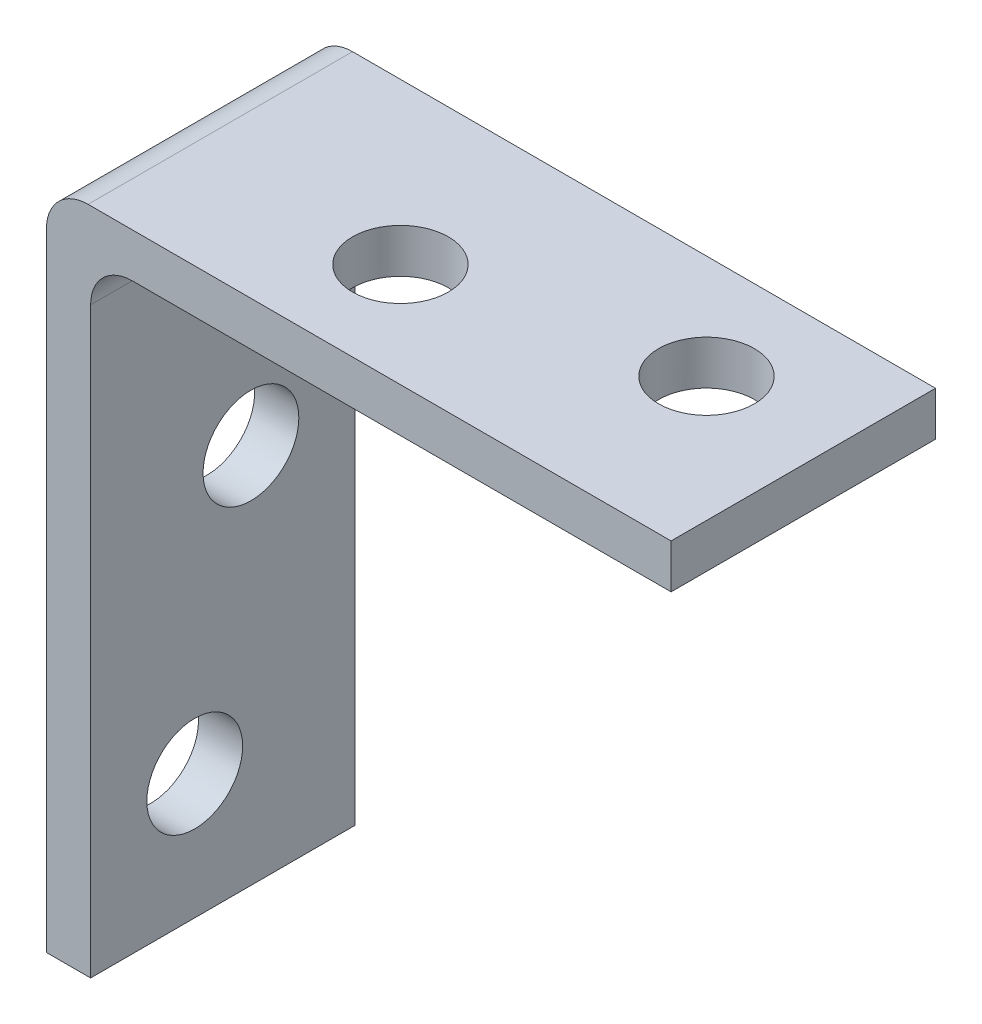
ISO-10303-21;
HEADER;
FILE_DESCRIPTION(('STEP AP214'),'2;1');
FILE_NAME('part.step','',(''),(''),'','','');
FILE_SCHEMA(('AUTOMOTIVE_DESIGN { 1 0 10303 214 1 1 1 1 }'));
ENDSEC;
DATA;
#1=APPLICATION_CONTEXT('core data for automotive mechanical design processes');
#2=APPLICATION_PROTOCOL_DEFINITION('international standard','automotive_design',2000,#1);
#3=PRODUCT_CONTEXT('',#1,'mechanical');
#4=PRODUCT('Part','Part','',(#3));
#5=PRODUCT_RELATED_PRODUCT_CATEGORY('part','',(#4));
#6=PRODUCT_DEFINITION_FORMATION('','',#4);
#7=PRODUCT_DEFINITION_CONTEXT('part definition',#1,'design');
#8=PRODUCT_DEFINITION('design','',#6,#7);
#9=PRODUCT_DEFINITION_SHAPE('','',#8);
#10=(LENGTH_UNIT() NAMED_UNIT(*) SI_UNIT(.MILLI.,.METRE.));
#11=(NAMED_UNIT(*) PLANE_ANGLE_UNIT() SI_UNIT($,.RADIAN.));
#12=(NAMED_UNIT(*) SI_UNIT($,.STERADIAN.) SOLID_ANGLE_UNIT());
#13=UNCERTAINTY_MEASURE_WITH_UNIT(LENGTH_MEASURE(1.E-05),#10,'distance_accuracy_value','');
#14=(GEOMETRIC_REPRESENTATION_CONTEXT(3) GLOBAL_UNCERTAINTY_ASSIGNED_CONTEXT((#13)) GLOBAL_UNIT_ASSIGNED_CONTEXT((#10,
#11,#12)) REPRESENTATION_CONTEXT('',''));
#15=CARTESIAN_POINT('',(0.,0.,0.));
#16=DIRECTION('',(0.,0.,1.));
#17=DIRECTION('',(1.,0.,0.));
#18=AXIS2_PLACEMENT_3D('',#15,#16,#17);
#19=CARTESIAN_POINT('',(0.,38.1,-8.0645));
#20=DIRECTION('',(-1.,0.,0.));
#21=DIRECTION('',(0.,0.,1.));
#22=AXIS2_PLACEMENT_3D('',#19,#20,#21);
#23=PLANE('',#22);
#24=CARTESIAN_POINT('',(0.,7.62,1.7145));
#25=DIRECTION('',(-1.,0.,0.));
#26=DIRECTION('',(0.,0.,1.));
#27=AXIS2_PLACEMENT_3D('',#24,#25,#26);
#28=CIRCLE('',#27,2.921);
#29=CARTESIAN_POINT('',(0.,7.62,4.6355));
#30=VERTEX_POINT('',#29);
#31=EDGE_CURVE('E117',#30,#30,#28,.T.);
#32=ORIENTED_EDGE('',*,*,#31,.F.);
#33=EDGE_LOOP('',(#32));
#34=FACE_BOUND('',#33,.T.);
#35=CARTESIAN_POINT('',(0.,23.241,-1.7145));
#36=DIRECTION('',(-1.,0.,0.));
#37=DIRECTION('',(0.,0.,1.));
#38=AXIS2_PLACEMENT_3D('',#35,#36,#37);
#39=CIRCLE('',#38,2.921);
#40=CARTESIAN_POINT('',(0.,23.241,1.2065));
#41=VERTEX_POINT('',#40);
#42=EDGE_CURVE('E265',#41,#41,#39,.T.);
#43=ORIENTED_EDGE('',*,*,#42,.F.);
#44=EDGE_LOOP('',(#43));
#45=FACE_BOUND('',#44,.T.);
#46=DIRECTION('',(0.,-1.,0.));
#47=VECTOR('',#46,1.);
#48=CARTESIAN_POINT('',(0.,0.,8.0645));
#49=LINE('',#48,#47);
#50=CARTESIAN_POINT('',(0.,38.2524,8.0645));
#51=VERTEX_POINT('',#50);
#52=CARTESIAN_POINT('',(0.,0.,8.0645));
#53=VERTEX_POINT('',#52);
#54=EDGE_CURVE('E105',#51,#53,#49,.T.);
#55=ORIENTED_EDGE('',*,*,#54,.F.);
#56=DIRECTION('',(0.,0.,1.));
#57=VECTOR('',#56,1.);
#58=CARTESIAN_POINT('',(0.,38.2524,-8.0645));
#59=LINE('',#58,#57);
#60=CARTESIAN_POINT('',(0.,38.2524,-8.0645));
#61=VERTEX_POINT('',#60);
#62=EDGE_CURVE('E181',#51,#61,#59,.F.);
#63=ORIENTED_EDGE('',*,*,#62,.T.);
#64=DIRECTION('',(0.,-1.,0.));
#65=VECTOR('',#64,1.);
#66=CARTESIAN_POINT('',(0.,0.,-8.0645));
#67=LINE('',#66,#65);
#68=CARTESIAN_POINT('',(0.,0.,-8.0645));
#69=VERTEX_POINT('',#68);
#70=EDGE_CURVE('E122',#61,#69,#67,.T.);
#71=ORIENTED_EDGE('',*,*,#70,.T.);
#72=DIRECTION('',(0.,0.,1.));
#73=VECTOR('',#72,1.);
#74=CARTESIAN_POINT('',(0.,0.,-8.0645));
#75=LINE('',#74,#73);
#76=EDGE_CURVE('E120',#69,#53,#75,.T.);
#77=ORIENTED_EDGE('',*,*,#76,.T.);
#78=EDGE_LOOP('',(#55,#63,#71,#77));
#79=FACE_BOUND('',#78,.T.);
#80=ADVANCED_FACE('F39',(#34,#45,#79),#23,.T.);
#81=CARTESIAN_POINT('',(0.,40.7924,-8.0645));
#82=DIRECTION('',(0.,1.,0.));
#83=DIRECTION('',(0.,0.,1.));
#84=AXIS2_PLACEMENT_3D('',#81,#82,#83);
#85=PLANE('',#84);
#86=CARTESIAN_POINT('',(30.48,40.7924,-1.7145));
#87=DIRECTION('',(0.,1.,0.));
#88=DIRECTION('',(0.,0.,1.));
#89=AXIS2_PLACEMENT_3D('',#86,#87,#88);
#90=CIRCLE('',#89,2.921);
#91=CARTESIAN_POINT('',(30.48,40.7924,1.2065));
#92=VERTEX_POINT('',#91);
#93=EDGE_CURVE('E255',#92,#92,#90,.F.);
#94=ORIENTED_EDGE('',*,*,#93,.T.);
#95=EDGE_LOOP('',(#94));
#96=FACE_BOUND('',#95,.T.);
#97=CARTESIAN_POINT('',(15.24,40.7924,1.7145));
#98=DIRECTION('',(0.,1.,0.));
#99=DIRECTION('',(0.,0.,1.));
#100=AXIS2_PLACEMENT_3D('',#97,#98,#99);
#101=CIRCLE('',#100,2.921);
#102=CARTESIAN_POINT('',(15.24,40.7924,4.6355));
#103=VERTEX_POINT('',#102);
#104=EDGE_CURVE('E272',#103,#103,#101,.F.);
#105=ORIENTED_EDGE('',*,*,#104,.T.);
#106=EDGE_LOOP('',(#105));
#107=FACE_BOUND('',#106,.T.);
#108=DIRECTION('',(-1.,0.,0.));
#109=VECTOR('',#108,1.);
#110=CARTESIAN_POINT('',(0.,40.7924,-8.0645));
#111=LINE('',#110,#109);
#112=CARTESIAN_POINT('',(38.1,40.7924,-8.0645));
#113=VERTEX_POINT('',#112);
#114=CARTESIAN_POINT('',(2.54,40.7924,-8.0645));
#115=VERTEX_POINT('',#114);
#116=EDGE_CURVE('E128',#113,#115,#111,.T.);
#117=ORIENTED_EDGE('',*,*,#116,.T.);
#118=DIRECTION('',(0.,0.,1.));
#119=VECTOR('',#118,1.);
#120=CARTESIAN_POINT('',(2.54,40.7924,-8.0645));
#121=LINE('',#120,#119);
#122=CARTESIAN_POINT('',(2.54,40.7924,8.0645));
#123=VERTEX_POINT('',#122);
#124=EDGE_CURVE('E169',#115,#123,#121,.T.);
#125=ORIENTED_EDGE('',*,*,#124,.T.);
#126=DIRECTION('',(-1.,0.,0.));
#127=VECTOR('',#126,1.);
#128=CARTESIAN_POINT('',(0.,40.7924,8.0645));
#129=LINE('',#128,#127);
#130=CARTESIAN_POINT('',(38.1,40.7924,8.0645));
#131=VERTEX_POINT('',#130);
#132=EDGE_CURVE('E145',#131,#123,#129,.T.);
#133=ORIENTED_EDGE('',*,*,#132,.F.);
#134=DIRECTION('',(0.,0.,1.));
#135=VECTOR('',#134,1.);
#136=CARTESIAN_POINT('',(38.1,40.7924,-8.0645));
#137=LINE('',#136,#135);
#138=EDGE_CURVE('E166',#113,#131,#137,.T.);
#139=ORIENTED_EDGE('',*,*,#138,.F.);
#140=EDGE_LOOP('',(#117,#125,#133,#139));
#141=FACE_BOUND('',#140,.T.);
#142=ADVANCED_FACE('F208',(#96,#107,#141),#85,.T.);
#143=CARTESIAN_POINT('',(38.1,38.1,-8.0645));
#144=DIRECTION('',(1.,0.,0.));
#145=DIRECTION('',(0.,0.,-1.));
#146=AXIS2_PLACEMENT_3D('',#143,#144,#145);
#147=PLANE('',#146);
#148=ORIENTED_EDGE('',*,*,#138,.T.);
#149=DIRECTION('',(0.,1.,0.));
#150=VECTOR('',#149,1.);
#151=CARTESIAN_POINT('',(38.1,38.1,8.0645));
#152=LINE('',#151,#150);
#153=CARTESIAN_POINT('',(38.1,38.1,8.0645));
#154=VERTEX_POINT('',#153);
#155=EDGE_CURVE('E141',#154,#131,#152,.T.);
#156=ORIENTED_EDGE('',*,*,#155,.F.);
#157=DIRECTION('',(0.,0.,1.));
#158=VECTOR('',#157,1.);
#159=CARTESIAN_POINT('',(38.1,38.1,-8.0645));
#160=LINE('',#159,#158);
#161=CARTESIAN_POINT('',(38.1,38.1,-8.0645));
#162=VERTEX_POINT('',#161);
#163=EDGE_CURVE('E170',#162,#154,#160,.T.);
#164=ORIENTED_EDGE('',*,*,#163,.F.);
#165=DIRECTION('',(0.,1.,0.));
#166=VECTOR('',#165,1.);
#167=CARTESIAN_POINT('',(38.1,38.1,-8.0645));
#168=LINE('',#167,#166);
#169=EDGE_CURVE('E159',#162,#113,#168,.T.);
#170=ORIENTED_EDGE('',*,*,#169,.T.);
#171=EDGE_LOOP('',(#148,#156,#164,#170));
#172=FACE_BOUND('',#171,.T.);
#173=ADVANCED_FACE('F210',(#172),#147,.T.);
#174=CARTESIAN_POINT('',(2.6924,38.1,-8.0645));
#175=DIRECTION('',(0.,-1.,0.));
#176=DIRECTION('',(0.,0.,-1.));
#177=AXIS2_PLACEMENT_3D('',#174,#175,#176);
#178=PLANE('',#177);
#179=CARTESIAN_POINT('',(30.48,38.1,-1.7145));
#180=DIRECTION('',(0.,-1.,0.));
#181=DIRECTION('',(0.,0.,-1.));
#182=AXIS2_PLACEMENT_3D('',#179,#180,#181);
#183=CIRCLE('',#182,2.921);
#184=CARTESIAN_POINT('',(30.48,38.1,-4.6355));
#185=VERTEX_POINT('',#184);
#186=EDGE_CURVE('E258',#185,#185,#183,.T.);
#187=ORIENTED_EDGE('',*,*,#186,.F.);
#188=EDGE_LOOP('',(#187));
#189=FACE_BOUND('',#188,.T.);
#190=CARTESIAN_POINT('',(15.24,38.1,1.7145));
#191=DIRECTION('',(0.,-1.,0.));
#192=DIRECTION('',(0.,0.,-1.));
#193=AXIS2_PLACEMENT_3D('',#190,#191,#192);
#194=CIRCLE('',#193,2.921);
#195=CARTESIAN_POINT('',(15.24,38.1,-1.2065));
#196=VERTEX_POINT('',#195);
#197=EDGE_CURVE('E266',#196,#196,#194,.T.);
#198=ORIENTED_EDGE('',*,*,#197,.F.);
#199=EDGE_LOOP('',(#198));
#200=FACE_BOUND('',#199,.T.);
#201=DIRECTION('',(1.,0.,0.));
#202=VECTOR('',#201,1.);
#203=CARTESIAN_POINT('',(2.6924,38.1,8.0645));
#204=LINE('',#203,#202);
#205=CARTESIAN_POINT('',(5.2324,38.1,8.0645));
#206=VERTEX_POINT('',#205);
#207=EDGE_CURVE('E135',#206,#154,#204,.T.);
#208=ORIENTED_EDGE('',*,*,#207,.F.);
#209=DIRECTION('',(0.,0.,1.));
#210=VECTOR('',#209,1.);
#211=CARTESIAN_POINT('',(5.2324,38.1,-8.0645));
#212=LINE('',#211,#210);
#213=CARTESIAN_POINT('',(5.2324,38.1,-8.0645));
#214=VERTEX_POINT('',#213);
#215=EDGE_CURVE('E61',#206,#214,#212,.F.);
#216=ORIENTED_EDGE('',*,*,#215,.T.);
#217=DIRECTION('',(1.,0.,0.));
#218=VECTOR('',#217,1.);
#219=CARTESIAN_POINT('',(2.6924,38.1,-8.0645));
#220=LINE('',#219,#218);
#221=EDGE_CURVE('E156',#214,#162,#220,.T.);
#222=ORIENTED_EDGE('',*,*,#221,.T.);
#223=ORIENTED_EDGE('',*,*,#163,.T.);
#224=EDGE_LOOP('',(#208,#216,#222,#223));
#225=FACE_BOUND('',#224,.T.);
#226=ADVANCED_FACE('F195',(#189,#200,#225),#178,.T.);
#227=CARTESIAN_POINT('',(2.6924,0.,-8.0645));
#228=DIRECTION('',(1.,0.,0.));
#229=DIRECTION('',(0.,0.,-1.));
#230=AXIS2_PLACEMENT_3D('',#227,#228,#229);
#231=PLANE('',#230);
#232=CARTESIAN_POINT('',(2.6924,7.62,1.7145));
#233=DIRECTION('',(1.,0.,0.));
#234=DIRECTION('',(0.,0.,-1.));
#235=AXIS2_PLACEMENT_3D('',#232,#233,#234);
#236=CIRCLE('',#235,2.921);
#237=CARTESIAN_POINT('',(2.6924,7.62,-1.2065));
#238=VERTEX_POINT('',#237);
#239=EDGE_CURVE('E279',#238,#238,#236,.F.);
#240=ORIENTED_EDGE('',*,*,#239,.T.);
#241=EDGE_LOOP('',(#240));
#242=FACE_BOUND('',#241,.T.);
#243=CARTESIAN_POINT('',(2.6924,23.241,-1.7145));
#244=DIRECTION('',(1.,0.,0.));
#245=DIRECTION('',(0.,0.,-1.));
#246=AXIS2_PLACEMENT_3D('',#243,#244,#245);
#247=CIRCLE('',#246,2.921);
#248=CARTESIAN_POINT('',(2.6924,23.241,-4.6355));
#249=VERTEX_POINT('',#248);
#250=EDGE_CURVE('E260',#249,#249,#247,.F.);
#251=ORIENTED_EDGE('',*,*,#250,.T.);
#252=EDGE_LOOP('',(#251));
#253=FACE_BOUND('',#252,.T.);
#254=DIRECTION('',(0.,1.,0.));
#255=VECTOR('',#254,1.);
#256=CARTESIAN_POINT('',(2.6924,0.,-8.0645));
#257=LINE('',#256,#255);
#258=CARTESIAN_POINT('',(2.6924,0.,-8.0645));
#259=VERTEX_POINT('',#258);
#260=CARTESIAN_POINT('',(2.6924,35.56,-8.0645));
#261=VERTEX_POINT('',#260);
#262=EDGE_CURVE('E153',#259,#261,#257,.T.);
#263=ORIENTED_EDGE('',*,*,#262,.T.);
#264=DIRECTION('',(0.,0.,1.));
#265=VECTOR('',#264,1.);
#266=CARTESIAN_POINT('',(2.6924,35.56,8.0645));
#267=LINE('',#266,#265);
#268=CARTESIAN_POINT('',(2.6924,35.56,8.0645));
#269=VERTEX_POINT('',#268);
#270=EDGE_CURVE('E187',#261,#269,#267,.T.);
#271=ORIENTED_EDGE('',*,*,#270,.T.);
#272=DIRECTION('',(0.,1.,0.));
#273=VECTOR('',#272,1.);
#274=CARTESIAN_POINT('',(2.6924,0.,8.0645));
#275=LINE('',#274,#273);
#276=CARTESIAN_POINT('',(2.6924,0.,8.0645));
#277=VERTEX_POINT('',#276);
#278=EDGE_CURVE('E132',#277,#269,#275,.T.);
#279=ORIENTED_EDGE('',*,*,#278,.F.);
#280=DIRECTION('',(0.,0.,1.));
#281=VECTOR('',#280,1.);
#282=CARTESIAN_POINT('',(2.6924,0.,-8.0645));
#283=LINE('',#282,#281);
#284=EDGE_CURVE('E127',#259,#277,#283,.T.);
#285=ORIENTED_EDGE('',*,*,#284,.F.);
#286=EDGE_LOOP('',(#263,#271,#279,#285));
#287=FACE_BOUND('',#286,.T.);
#288=ADVANCED_FACE('F199',(#242,#253,#287),#231,.T.);
#289=CARTESIAN_POINT('',(0.,0.,-8.0645));
#290=DIRECTION('',(0.,-1.,0.));
#291=DIRECTION('',(0.,0.,-1.));
#292=AXIS2_PLACEMENT_3D('',#289,#290,#291);
#293=PLANE('',#292);
#294=ORIENTED_EDGE('',*,*,#284,.T.);
#295=DIRECTION('',(1.,0.,0.));
#296=VECTOR('',#295,1.);
#297=CARTESIAN_POINT('',(0.,0.,8.0645));
#298=LINE('',#297,#296);
#299=EDGE_CURVE('E111',#53,#277,#298,.T.);
#300=ORIENTED_EDGE('',*,*,#299,.F.);
#301=ORIENTED_EDGE('',*,*,#76,.F.);
#302=DIRECTION('',(1.,0.,0.));
#303=VECTOR('',#302,1.);
#304=CARTESIAN_POINT('',(0.,0.,-8.0645));
#305=LINE('',#304,#303);
#306=EDGE_CURVE('E150',#69,#259,#305,.T.);
#307=ORIENTED_EDGE('',*,*,#306,.T.);
#308=EDGE_LOOP('',(#294,#300,#301,#307));
#309=FACE_BOUND('',#308,.T.);
#310=ADVANCED_FACE('F130',(#309),#293,.T.);
#311=CARTESIAN_POINT('',(0.,0.,-8.0645));
#312=DIRECTION('',(0.,0.,-1.));
#313=DIRECTION('',(-1.,0.,0.));
#314=AXIS2_PLACEMENT_3D('',#311,#312,#313);
#315=PLANE('',#314);
#316=ORIENTED_EDGE('',*,*,#70,.F.);
#317=CARTESIAN_POINT('',(2.54,38.2524,-8.0645));
#318=DIRECTION('',(0.,0.,-1.));
#319=DIRECTION('',(-1.,0.,0.));
#320=AXIS2_PLACEMENT_3D('',#317,#318,#319);
#321=CIRCLE('',#320,2.54);
#322=EDGE_CURVE('E184',#61,#115,#321,.T.);
#323=ORIENTED_EDGE('',*,*,#322,.T.);
#324=ORIENTED_EDGE('',*,*,#116,.F.);
#325=ORIENTED_EDGE('',*,*,#169,.F.);
#326=ORIENTED_EDGE('',*,*,#221,.F.);
#327=CARTESIAN_POINT('',(5.2324,35.56,-8.0645));
#328=DIRECTION('',(0.,0.,-1.));
#329=DIRECTION('',(-1.,0.,0.));
#330=AXIS2_PLACEMENT_3D('',#327,#328,#329);
#331=CIRCLE('',#330,2.54);
#332=EDGE_CURVE('E11',#214,#261,#331,.F.);
#333=ORIENTED_EDGE('',*,*,#332,.T.);
#334=ORIENTED_EDGE('',*,*,#262,.F.);
#335=ORIENTED_EDGE('',*,*,#306,.F.);
#336=EDGE_LOOP('',(#316,#323,#324,#325,#326,#333,#334,#335));
#337=FACE_BOUND('',#336,.T.);
#338=ADVANCED_FACE('F200',(#337),#315,.T.);
#339=CARTESIAN_POINT('',(0.,0.,8.0645));
#340=DIRECTION('',(0.,0.,-1.));
#341=DIRECTION('',(-1.,0.,0.));
#342=AXIS2_PLACEMENT_3D('',#339,#340,#341);
#343=PLANE('',#342);
#344=ORIENTED_EDGE('',*,*,#132,.T.);
#345=CARTESIAN_POINT('',(2.54,38.2524,8.0645));
#346=DIRECTION('',(0.,0.,-1.));
#347=DIRECTION('',(-1.,0.,0.));
#348=AXIS2_PLACEMENT_3D('',#345,#346,#347);
#349=CIRCLE('',#348,2.54);
#350=EDGE_CURVE('E113',#123,#51,#349,.F.);
#351=ORIENTED_EDGE('',*,*,#350,.T.);
#352=ORIENTED_EDGE('',*,*,#54,.T.);
#353=ORIENTED_EDGE('',*,*,#299,.T.);
#354=ORIENTED_EDGE('',*,*,#278,.T.);
#355=CARTESIAN_POINT('',(5.2324,35.56,8.0645));
#356=DIRECTION('',(0.,0.,-1.));
#357=DIRECTION('',(-1.,0.,0.));
#358=AXIS2_PLACEMENT_3D('',#355,#356,#357);
#359=CIRCLE('',#358,2.54);
#360=EDGE_CURVE('E48',#269,#206,#359,.T.);
#361=ORIENTED_EDGE('',*,*,#360,.T.);
#362=ORIENTED_EDGE('',*,*,#207,.T.);
#363=ORIENTED_EDGE('',*,*,#155,.T.);
#364=EDGE_LOOP('',(#344,#351,#352,#353,#354,#361,#362,#363));
#365=FACE_BOUND('',#364,.T.);
#366=ADVANCED_FACE('F108',(#365),#343,.F.);
#367=CARTESIAN_POINT('',(38.101,23.241,-1.7145));
#368=DIRECTION('',(-1.,0.,0.));
#369=DIRECTION('',(0.,0.,1.));
#370=AXIS2_PLACEMENT_3D('',#367,#368,#369);
#371=CYLINDRICAL_SURFACE('',#370,2.921);
#372=ORIENTED_EDGE('',*,*,#250,.F.);
#373=EDGE_LOOP('',(#372));
#374=FACE_BOUND('',#373,.T.);
#375=ORIENTED_EDGE('',*,*,#42,.T.);
#376=EDGE_LOOP('',(#375));
#377=FACE_BOUND('',#376,.T.);
#378=ADVANCED_FACE('F234',(#374,#377),#371,.F.);
#379=CARTESIAN_POINT('',(38.101,7.62,1.7145));
#380=DIRECTION('',(-1.,0.,0.));
#381=DIRECTION('',(0.,0.,1.));
#382=AXIS2_PLACEMENT_3D('',#379,#380,#381);
#383=CYLINDRICAL_SURFACE('',#382,2.921);
#384=ORIENTED_EDGE('',*,*,#239,.F.);
#385=EDGE_LOOP('',(#384));
#386=FACE_BOUND('',#385,.T.);
#387=ORIENTED_EDGE('',*,*,#31,.T.);
#388=EDGE_LOOP('',(#387));
#389=FACE_BOUND('',#388,.T.);
#390=ADVANCED_FACE('F237',(#386,#389),#383,.F.);
#391=CARTESIAN_POINT('',(15.24,40.7934,1.7145));
#392=DIRECTION('',(0.,-1.,0.));
#393=DIRECTION('',(0.,0.,-1.));
#394=AXIS2_PLACEMENT_3D('',#391,#392,#393);
#395=CYLINDRICAL_SURFACE('',#394,2.921);
#396=ORIENTED_EDGE('',*,*,#104,.F.);
#397=EDGE_LOOP('',(#396));
#398=FACE_BOUND('',#397,.T.);
#399=ORIENTED_EDGE('',*,*,#197,.T.);
#400=EDGE_LOOP('',(#399));
#401=FACE_BOUND('',#400,.T.);
#402=ADVANCED_FACE('F241',(#398,#401),#395,.F.);
#403=CARTESIAN_POINT('',(30.48,40.7934,-1.7145));
#404=DIRECTION('',(0.,-1.,0.));
#405=DIRECTION('',(0.,0.,-1.));
#406=AXIS2_PLACEMENT_3D('',#403,#404,#405);
#407=CYLINDRICAL_SURFACE('',#406,2.921);
#408=ORIENTED_EDGE('',*,*,#93,.F.);
#409=EDGE_LOOP('',(#408));
#410=FACE_BOUND('',#409,.T.);
#411=ORIENTED_EDGE('',*,*,#186,.T.);
#412=EDGE_LOOP('',(#411));
#413=FACE_BOUND('',#412,.T.);
#414=ADVANCED_FACE('F245',(#410,#413),#407,.F.);
#415=CARTESIAN_POINT('',(2.54,38.2524,-8.0645));
#416=DIRECTION('',(0.,0.,1.));
#417=DIRECTION('',(1.,0.,0.));
#418=AXIS2_PLACEMENT_3D('',#415,#416,#417);
#419=CYLINDRICAL_SURFACE('',#418,2.54);
#420=ORIENTED_EDGE('',*,*,#322,.F.);
#421=ORIENTED_EDGE('',*,*,#62,.F.);
#422=ORIENTED_EDGE('',*,*,#350,.F.);
#423=ORIENTED_EDGE('',*,*,#124,.F.);
#424=EDGE_LOOP('',(#420,#421,#422,#423));
#425=FACE_BOUND('',#424,.T.);
#426=ADVANCED_FACE('F205',(#425),#419,.T.);
#427=CARTESIAN_POINT('',(5.2324,35.56,-8.0645));
#428=DIRECTION('',(0.,0.,-1.));
#429=DIRECTION('',(-1.,0.,0.));
#430=AXIS2_PLACEMENT_3D('',#427,#428,#429);
#431=CYLINDRICAL_SURFACE('',#430,2.54);
#432=ORIENTED_EDGE('',*,*,#332,.F.);
#433=ORIENTED_EDGE('',*,*,#215,.F.);
#434=ORIENTED_EDGE('',*,*,#360,.F.);
#435=ORIENTED_EDGE('',*,*,#270,.F.);
#436=EDGE_LOOP('',(#432,#433,#434,#435));
#437=FACE_BOUND('',#436,.T.);
#438=ADVANCED_FACE('F41',(#437),#431,.F.);
#439=CLOSED_SHELL('',(#80,#142,#173,#226,#288,#310,#338,#366,#378,#390,#402,#414,#426,#438));
#440=MANIFOLD_SOLID_BREP('B2',#439);
#441=ADVANCED_BREP_SHAPE_REPRESENTATION('',(#18,#440),#14);
#442=SHAPE_DEFINITION_REPRESENTATION(#9,#441);
ENDSEC;
END-ISO-10303-21;
